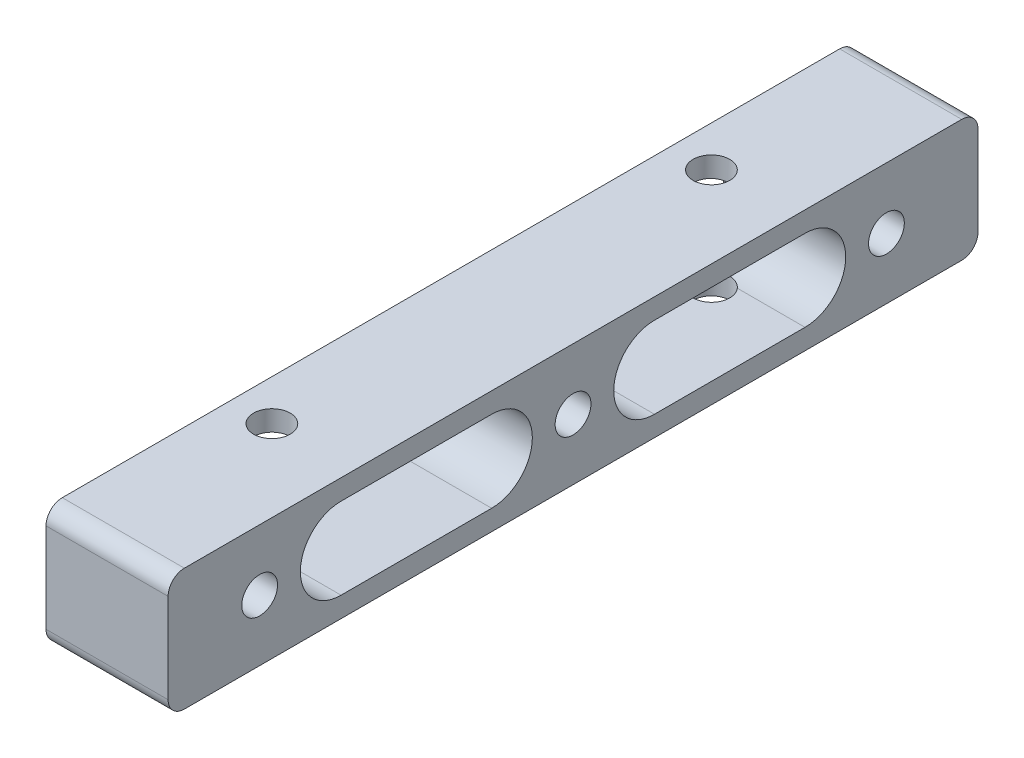
ISO-10303-21;
HEADER;
FILE_DESCRIPTION(('STEP AP214'),'2;1');
FILE_NAME('part.step','',(''),(''),'','','');
FILE_SCHEMA(('AUTOMOTIVE_DESIGN { 1 0 10303 214 1 1 1 1 }'));
ENDSEC;
DATA;
#1=APPLICATION_CONTEXT('core data for automotive mechanical design processes');
#2=APPLICATION_PROTOCOL_DEFINITION('international standard','automotive_design',2000,#1);
#3=PRODUCT_CONTEXT('',#1,'mechanical');
#4=PRODUCT('Part','Part','',(#3));
#5=PRODUCT_RELATED_PRODUCT_CATEGORY('part','',(#4));
#6=PRODUCT_DEFINITION_FORMATION('','',#4);
#7=PRODUCT_DEFINITION_CONTEXT('part definition',#1,'design');
#8=PRODUCT_DEFINITION('design','',#6,#7);
#9=PRODUCT_DEFINITION_SHAPE('','',#8);
#10=(LENGTH_UNIT() NAMED_UNIT(*) SI_UNIT(.MILLI.,.METRE.));
#11=(NAMED_UNIT(*) PLANE_ANGLE_UNIT() SI_UNIT($,.RADIAN.));
#12=(NAMED_UNIT(*) SI_UNIT($,.STERADIAN.) SOLID_ANGLE_UNIT());
#13=UNCERTAINTY_MEASURE_WITH_UNIT(LENGTH_MEASURE(1.E-05),#10,'distance_accuracy_value','');
#14=(GEOMETRIC_REPRESENTATION_CONTEXT(3) GLOBAL_UNCERTAINTY_ASSIGNED_CONTEXT((#13)) GLOBAL_UNIT_ASSIGNED_CONTEXT((#10,
#11,#12)) REPRESENTATION_CONTEXT('',''));
#15=CARTESIAN_POINT('',(0.,0.,0.));
#16=DIRECTION('',(0.,0.,1.));
#17=DIRECTION('',(1.,0.,0.));
#18=AXIS2_PLACEMENT_3D('',#15,#16,#17);
#19=CARTESIAN_POINT('',(15.,0.,0.));
#20=DIRECTION('',(0.,0.,-1.));
#21=DIRECTION('',(0.,1.,0.));
#22=AXIS2_PLACEMENT_3D('',#19,#20,#21);
#23=PLANE('',#22);
#24=DIRECTION('',(0.,-1.,0.));
#25=VECTOR('',#24,1.);
#26=CARTESIAN_POINT('',(0.,0.,0.));
#27=LINE('',#26,#25);
#28=CARTESIAN_POINT('',(0.,-2.,0.));
#29=VERTEX_POINT('',#28);
#30=CARTESIAN_POINT('',(0.,-13.,0.));
#31=VERTEX_POINT('',#30);
#32=EDGE_CURVE('E257',#29,#31,#27,.T.);
#33=ORIENTED_EDGE('',*,*,#32,.T.);
#34=DIRECTION('',(-1.,0.,0.));
#35=VECTOR('',#34,1.);
#36=CARTESIAN_POINT('',(15.,-13.,0.));
#37=LINE('',#36,#35);
#38=CARTESIAN_POINT('',(15.,-13.,0.));
#39=VERTEX_POINT('',#38);
#40=EDGE_CURVE('E180',#31,#39,#37,.F.);
#41=ORIENTED_EDGE('',*,*,#40,.T.);
#42=DIRECTION('',(0.,-1.,0.));
#43=VECTOR('',#42,1.);
#44=CARTESIAN_POINT('',(15.,0.,0.));
#45=LINE('',#44,#43);
#46=CARTESIAN_POINT('',(15.,-2.,0.));
#47=VERTEX_POINT('',#46);
#48=EDGE_CURVE('E243',#47,#39,#45,.T.);
#49=ORIENTED_EDGE('',*,*,#48,.F.);
#50=DIRECTION('',(-1.,0.,0.));
#51=VECTOR('',#50,1.);
#52=CARTESIAN_POINT('',(15.,-2.,0.));
#53=LINE('',#52,#51);
#54=EDGE_CURVE('E328',#47,#29,#53,.T.);
#55=ORIENTED_EDGE('',*,*,#54,.T.);
#56=EDGE_LOOP('',(#33,#41,#49,#55));
#57=FACE_BOUND('',#56,.T.);
#58=ADVANCED_FACE('F39',(#57),#23,.F.);
#59=CARTESIAN_POINT('',(15.,-15.,0.));
#60=DIRECTION('',(0.,1.,0.));
#61=DIRECTION('',(0.,0.,1.));
#62=AXIS2_PLACEMENT_3D('',#59,#60,#61);
#63=PLANE('',#62);
#64=CARTESIAN_POINT('',(5.00000000000001,-15.,-22.75));
#65=DIRECTION('',(0.,1.,0.));
#66=DIRECTION('',(0.,0.,1.));
#67=AXIS2_PLACEMENT_3D('',#64,#65,#66);
#68=CIRCLE('',#67,2.25);
#69=CARTESIAN_POINT('',(5.00000000000001,-15.,-20.5));
#70=VERTEX_POINT('',#69);
#71=EDGE_CURVE('E677',#70,#70,#68,.T.);
#72=ORIENTED_EDGE('',*,*,#71,.T.);
#73=EDGE_LOOP('',(#72));
#74=FACE_BOUND('',#73,.T.);
#75=CARTESIAN_POINT('',(5.00000000000001,-15.,-76.75));
#76=DIRECTION('',(0.,1.,0.));
#77=DIRECTION('',(0.,0.,1.));
#78=AXIS2_PLACEMENT_3D('',#75,#76,#77);
#79=CIRCLE('',#78,2.25);
#80=CARTESIAN_POINT('',(5.00000000000001,-15.,-74.5));
#81=VERTEX_POINT('',#80);
#82=EDGE_CURVE('E220',#81,#81,#79,.T.);
#83=ORIENTED_EDGE('',*,*,#82,.T.);
#84=EDGE_LOOP('',(#83));
#85=FACE_BOUND('',#84,.T.);
#86=DIRECTION('',(0.,0.,-1.));
#87=VECTOR('',#86,1.);
#88=CARTESIAN_POINT('',(0.,-15.,0.));
#89=LINE('',#88,#87);
#90=CARTESIAN_POINT('',(0.,-15.,-2.));
#91=VERTEX_POINT('',#90);
#92=CARTESIAN_POINT('',(0.,-15.,-97.5));
#93=VERTEX_POINT('',#92);
#94=EDGE_CURVE('E260',#91,#93,#89,.T.);
#95=ORIENTED_EDGE('',*,*,#94,.T.);
#96=DIRECTION('',(-1.,0.,0.));
#97=VECTOR('',#96,1.);
#98=CARTESIAN_POINT('',(15.,-15.,-97.5));
#99=LINE('',#98,#97);
#100=CARTESIAN_POINT('',(15.,-15.,-97.5));
#101=VERTEX_POINT('',#100);
#102=EDGE_CURVE('E313',#93,#101,#99,.F.);
#103=ORIENTED_EDGE('',*,*,#102,.T.);
#104=DIRECTION('',(0.,0.,-1.));
#105=VECTOR('',#104,1.);
#106=CARTESIAN_POINT('',(15.,-15.,0.));
#107=LINE('',#106,#105);
#108=CARTESIAN_POINT('',(15.,-15.,-2.));
#109=VERTEX_POINT('',#108);
#110=EDGE_CURVE('E246',#109,#101,#107,.T.);
#111=ORIENTED_EDGE('',*,*,#110,.F.);
#112=DIRECTION('',(-1.,0.,0.));
#113=VECTOR('',#112,1.);
#114=CARTESIAN_POINT('',(15.,-15.,-2.));
#115=LINE('',#114,#113);
#116=EDGE_CURVE('E310',#109,#91,#115,.T.);
#117=ORIENTED_EDGE('',*,*,#116,.T.);
#118=EDGE_LOOP('',(#95,#103,#111,#117));
#119=FACE_BOUND('',#118,.T.);
#120=ADVANCED_FACE('F346',(#74,#85,#119),#63,.F.);
#121=CARTESIAN_POINT('',(15.,0.,-99.5));
#122=DIRECTION('',(0.,0.,1.));
#123=DIRECTION('',(0.,-1.,0.));
#124=AXIS2_PLACEMENT_3D('',#121,#122,#123);
#125=PLANE('',#124);
#126=DIRECTION('',(0.,1.,0.));
#127=VECTOR('',#126,1.);
#128=CARTESIAN_POINT('',(15.,0.,-99.5));
#129=LINE('',#128,#127);
#130=CARTESIAN_POINT('',(15.,-13.,-99.5));
#131=VERTEX_POINT('',#130);
#132=CARTESIAN_POINT('',(15.,-2.,-99.5));
#133=VERTEX_POINT('',#132);
#134=EDGE_CURVE('E250',#131,#133,#129,.T.);
#135=ORIENTED_EDGE('',*,*,#134,.F.);
#136=DIRECTION('',(-1.,0.,0.));
#137=VECTOR('',#136,1.);
#138=CARTESIAN_POINT('',(15.,-13.,-99.5));
#139=LINE('',#138,#137);
#140=CARTESIAN_POINT('',(0.,-13.,-99.5));
#141=VERTEX_POINT('',#140);
#142=EDGE_CURVE('E299',#131,#141,#139,.T.);
#143=ORIENTED_EDGE('',*,*,#142,.T.);
#144=DIRECTION('',(0.,1.,0.));
#145=VECTOR('',#144,1.);
#146=CARTESIAN_POINT('',(0.,0.,-99.5));
#147=LINE('',#146,#145);
#148=CARTESIAN_POINT('',(0.,-2.,-99.5));
#149=VERTEX_POINT('',#148);
#150=EDGE_CURVE('E264',#141,#149,#147,.T.);
#151=ORIENTED_EDGE('',*,*,#150,.T.);
#152=DIRECTION('',(-1.,0.,0.));
#153=VECTOR('',#152,1.);
#154=CARTESIAN_POINT('',(15.,-2.,-99.5));
#155=LINE('',#154,#153);
#156=EDGE_CURVE('E297',#149,#133,#155,.F.);
#157=ORIENTED_EDGE('',*,*,#156,.T.);
#158=EDGE_LOOP('',(#135,#143,#151,#157));
#159=FACE_BOUND('',#158,.T.);
#160=ADVANCED_FACE('F357',(#159),#125,.F.);
#161=CARTESIAN_POINT('',(15.,0.,0.));
#162=DIRECTION('',(0.,-1.,0.));
#163=DIRECTION('',(0.,0.,-1.));
#164=AXIS2_PLACEMENT_3D('',#161,#162,#163);
#165=PLANE('',#164);
#166=CARTESIAN_POINT('',(5.00000000000001,0.,-22.75));
#167=DIRECTION('',(0.,1.,0.));
#168=DIRECTION('',(0.,0.,1.));
#169=AXIS2_PLACEMENT_3D('',#166,#167,#168);
#170=CIRCLE('',#169,2.25);
#171=CARTESIAN_POINT('',(5.00000000000001,0.,-20.5));
#172=VERTEX_POINT('',#171);
#173=EDGE_CURVE('E190',#172,#172,#170,.T.);
#174=ORIENTED_EDGE('',*,*,#173,.F.);
#175=EDGE_LOOP('',(#174));
#176=FACE_BOUND('',#175,.T.);
#177=CARTESIAN_POINT('',(5.00000000000001,0.,-76.75));
#178=DIRECTION('',(0.,1.,0.));
#179=DIRECTION('',(0.,0.,1.));
#180=AXIS2_PLACEMENT_3D('',#177,#178,#179);
#181=CIRCLE('',#180,2.25);
#182=CARTESIAN_POINT('',(5.00000000000001,0.,-74.5));
#183=VERTEX_POINT('',#182);
#184=EDGE_CURVE('E724',#183,#183,#181,.T.);
#185=ORIENTED_EDGE('',*,*,#184,.F.);
#186=EDGE_LOOP('',(#185));
#187=FACE_BOUND('',#186,.T.);
#188=DIRECTION('',(0.,0.,1.));
#189=VECTOR('',#188,1.);
#190=CARTESIAN_POINT('',(15.,0.,0.));
#191=LINE('',#190,#189);
#192=CARTESIAN_POINT('',(15.,0.,-97.5));
#193=VERTEX_POINT('',#192);
#194=CARTESIAN_POINT('',(15.,0.,-2.));
#195=VERTEX_POINT('',#194);
#196=EDGE_CURVE('E253',#193,#195,#191,.T.);
#197=ORIENTED_EDGE('',*,*,#196,.F.);
#198=DIRECTION('',(-1.,0.,0.));
#199=VECTOR('',#198,1.);
#200=CARTESIAN_POINT('',(15.,0.,-97.5));
#201=LINE('',#200,#199);
#202=CARTESIAN_POINT('',(0.,0.,-97.5));
#203=VERTEX_POINT('',#202);
#204=EDGE_CURVE('E325',#193,#203,#201,.T.);
#205=ORIENTED_EDGE('',*,*,#204,.T.);
#206=DIRECTION('',(0.,0.,1.));
#207=VECTOR('',#206,1.);
#208=CARTESIAN_POINT('',(0.,0.,0.));
#209=LINE('',#208,#207);
#210=CARTESIAN_POINT('',(0.,0.,-2.));
#211=VERTEX_POINT('',#210);
#212=EDGE_CURVE('E247',#203,#211,#209,.T.);
#213=ORIENTED_EDGE('',*,*,#212,.T.);
#214=DIRECTION('',(-1.,0.,0.));
#215=VECTOR('',#214,1.);
#216=CARTESIAN_POINT('',(15.,0.,-2.));
#217=LINE('',#216,#215);
#218=EDGE_CURVE('E323',#211,#195,#217,.F.);
#219=ORIENTED_EDGE('',*,*,#218,.T.);
#220=EDGE_LOOP('',(#197,#205,#213,#219));
#221=FACE_BOUND('',#220,.T.);
#222=ADVANCED_FACE('F366',(#176,#187,#221),#165,.F.);
#223=CARTESIAN_POINT('',(15.,0.,0.));
#224=DIRECTION('',(1.,0.,0.));
#225=DIRECTION('',(0.,0.,-1.));
#226=AXIS2_PLACEMENT_3D('',#223,#224,#225);
#227=PLANE('',#226);
#228=CARTESIAN_POINT('',(15.,-7.5,-39.75));
#229=DIRECTION('',(1.,0.,0.));
#230=DIRECTION('',(0.,0.,-1.));
#231=AXIS2_PLACEMENT_3D('',#228,#229,#230);
#232=CIRCLE('',#231,5.);
#233=CARTESIAN_POINT('',(15.,-12.5,-39.75));
#234=VERTEX_POINT('',#233);
#235=CARTESIAN_POINT('',(15.,-2.5,-39.75));
#236=VERTEX_POINT('',#235);
#237=EDGE_CURVE('E231',#234,#236,#232,.T.);
#238=ORIENTED_EDGE('',*,*,#237,.F.);
#239=DIRECTION('',(0.,0.,-1.));
#240=VECTOR('',#239,1.);
#241=CARTESIAN_POINT('',(15.,-12.5,-21.25));
#242=LINE('',#241,#240);
#243=CARTESIAN_POINT('',(15.,-12.5,-21.25));
#244=VERTEX_POINT('',#243);
#245=EDGE_CURVE('E200',#244,#234,#242,.T.);
#246=ORIENTED_EDGE('',*,*,#245,.F.);
#247=CARTESIAN_POINT('',(15.,-7.5,-21.25));
#248=DIRECTION('',(1.,0.,0.));
#249=DIRECTION('',(0.,0.,-1.));
#250=AXIS2_PLACEMENT_3D('',#247,#248,#249);
#251=CIRCLE('',#250,5.00000000000001);
#252=CARTESIAN_POINT('',(15.,-2.49999999999999,-21.25));
#253=VERTEX_POINT('',#252);
#254=EDGE_CURVE('E698',#253,#244,#251,.T.);
#255=ORIENTED_EDGE('',*,*,#254,.F.);
#256=DIRECTION('',(0.,0.,-1.));
#257=VECTOR('',#256,1.);
#258=CARTESIAN_POINT('',(15.,-2.5,-21.25));
#259=LINE('',#258,#257);
#260=EDGE_CURVE('E195',#253,#236,#259,.T.);
#261=ORIENTED_EDGE('',*,*,#260,.T.);
#262=EDGE_LOOP('',(#238,#246,#255,#261));
#263=FACE_BOUND('',#262,.T.);
#264=CARTESIAN_POINT('',(15.,-7.5,-59.75));
#265=DIRECTION('',(1.,0.,0.));
#266=DIRECTION('',(0.,0.,-1.));
#267=AXIS2_PLACEMENT_3D('',#264,#265,#266);
#268=CIRCLE('',#267,5.);
#269=CARTESIAN_POINT('',(15.,-2.49999999999999,-59.75));
#270=VERTEX_POINT('',#269);
#271=CARTESIAN_POINT('',(15.,-12.5,-59.75));
#272=VERTEX_POINT('',#271);
#273=EDGE_CURVE('E229',#270,#272,#268,.T.);
#274=ORIENTED_EDGE('',*,*,#273,.F.);
#275=DIRECTION('',(0.,0.,-1.));
#276=VECTOR('',#275,1.);
#277=CARTESIAN_POINT('',(15.,-2.49999999999999,-59.75));
#278=LINE('',#277,#276);
#279=CARTESIAN_POINT('',(15.,-2.49999999999998,-78.25));
#280=VERTEX_POINT('',#279);
#281=EDGE_CURVE('E209',#270,#280,#278,.T.);
#282=ORIENTED_EDGE('',*,*,#281,.T.);
#283=CARTESIAN_POINT('',(15.,-7.49999999999999,-78.25));
#284=DIRECTION('',(1.,0.,0.));
#285=DIRECTION('',(0.,0.,-1.));
#286=AXIS2_PLACEMENT_3D('',#283,#284,#285);
#287=CIRCLE('',#286,5.00000000000001);
#288=CARTESIAN_POINT('',(15.,-12.5,-78.25));
#289=VERTEX_POINT('',#288);
#290=EDGE_CURVE('E223',#289,#280,#287,.T.);
#291=ORIENTED_EDGE('',*,*,#290,.F.);
#292=DIRECTION('',(0.,0.,-1.));
#293=VECTOR('',#292,1.);
#294=CARTESIAN_POINT('',(15.,-12.5,-59.75));
#295=LINE('',#294,#293);
#296=EDGE_CURVE('E226',#272,#289,#295,.T.);
#297=ORIENTED_EDGE('',*,*,#296,.F.);
#298=EDGE_LOOP('',(#274,#282,#291,#297));
#299=FACE_BOUND('',#298,.T.);
#300=CARTESIAN_POINT('',(15.,-7.49999999999999,-88.25));
#301=DIRECTION('',(1.,0.,0.));
#302=DIRECTION('',(0.,0.,-1.));
#303=AXIS2_PLACEMENT_3D('',#300,#301,#302);
#304=CIRCLE('',#303,2.2);
#305=CARTESIAN_POINT('',(15.,-7.49999999999999,-90.45));
#306=VERTEX_POINT('',#305);
#307=EDGE_CURVE('E236',#306,#306,#304,.T.);
#308=ORIENTED_EDGE('',*,*,#307,.F.);
#309=EDGE_LOOP('',(#308));
#310=FACE_BOUND('',#309,.T.);
#311=CARTESIAN_POINT('',(15.,-7.5,-11.25));
#312=DIRECTION('',(1.,0.,0.));
#313=DIRECTION('',(0.,0.,-1.));
#314=AXIS2_PLACEMENT_3D('',#311,#312,#313);
#315=CIRCLE('',#314,2.2);
#316=CARTESIAN_POINT('',(15.,-7.5,-13.45));
#317=VERTEX_POINT('',#316);
#318=EDGE_CURVE('E232',#317,#317,#315,.T.);
#319=ORIENTED_EDGE('',*,*,#318,.F.);
#320=EDGE_LOOP('',(#319));
#321=FACE_BOUND('',#320,.T.);
#322=CARTESIAN_POINT('',(15.,-7.5,-49.75));
#323=DIRECTION('',(1.,0.,0.));
#324=DIRECTION('',(0.,0.,-1.));
#325=AXIS2_PLACEMENT_3D('',#322,#323,#324);
#326=CIRCLE('',#325,2.2);
#327=CARTESIAN_POINT('',(15.,-7.5,-51.95));
#328=VERTEX_POINT('',#327);
#329=EDGE_CURVE('E235',#328,#328,#326,.T.);
#330=ORIENTED_EDGE('',*,*,#329,.F.);
#331=EDGE_LOOP('',(#330));
#332=FACE_BOUND('',#331,.T.);
#333=ORIENTED_EDGE('',*,*,#110,.T.);
#334=CARTESIAN_POINT('',(15.,-13.,-97.5));
#335=DIRECTION('',(1.,0.,0.));
#336=DIRECTION('',(0.,0.,-1.));
#337=AXIS2_PLACEMENT_3D('',#334,#335,#336);
#338=CIRCLE('',#337,2.);
#339=EDGE_CURVE('E321',#101,#131,#338,.T.);
#340=ORIENTED_EDGE('',*,*,#339,.T.);
#341=ORIENTED_EDGE('',*,*,#134,.T.);
#342=CARTESIAN_POINT('',(15.,-2.,-97.5));
#343=DIRECTION('',(1.,0.,0.));
#344=DIRECTION('',(0.,0.,-1.));
#345=AXIS2_PLACEMENT_3D('',#342,#343,#344);
#346=CIRCLE('',#345,2.);
#347=EDGE_CURVE('E319',#133,#193,#346,.T.);
#348=ORIENTED_EDGE('',*,*,#347,.T.);
#349=ORIENTED_EDGE('',*,*,#196,.T.);
#350=CARTESIAN_POINT('',(15.,-2.,-2.));
#351=DIRECTION('',(1.,0.,0.));
#352=DIRECTION('',(0.,0.,-1.));
#353=AXIS2_PLACEMENT_3D('',#350,#351,#352);
#354=CIRCLE('',#353,2.);
#355=EDGE_CURVE('E315',#195,#47,#354,.T.);
#356=ORIENTED_EDGE('',*,*,#355,.T.);
#357=ORIENTED_EDGE('',*,*,#48,.T.);
#358=CARTESIAN_POINT('',(15.,-13.,-2.));
#359=DIRECTION('',(1.,0.,0.));
#360=DIRECTION('',(0.,0.,-1.));
#361=AXIS2_PLACEMENT_3D('',#358,#359,#360);
#362=CIRCLE('',#361,2.);
#363=EDGE_CURVE('E317',#39,#109,#362,.T.);
#364=ORIENTED_EDGE('',*,*,#363,.T.);
#365=EDGE_LOOP('',(#333,#340,#341,#348,#349,#356,#357,#364));
#366=FACE_BOUND('',#365,.T.);
#367=ADVANCED_FACE('F339',(#263,#299,#310,#321,#332,#366),#227,.T.);
#368=CARTESIAN_POINT('',(0.,0.,0.));
#369=DIRECTION('',(1.,0.,0.));
#370=DIRECTION('',(0.,0.,-1.));
#371=AXIS2_PLACEMENT_3D('',#368,#369,#370);
#372=PLANE('',#371);
#373=DIRECTION('',(0.,0.,-1.));
#374=VECTOR('',#373,1.);
#375=CARTESIAN_POINT('',(0.,-12.5,0.));
#376=LINE('',#375,#374);
#377=CARTESIAN_POINT('',(0.,-12.5,-21.25));
#378=VERTEX_POINT('',#377);
#379=CARTESIAN_POINT('',(0.,-12.5,-39.75));
#380=VERTEX_POINT('',#379);
#381=EDGE_CURVE('E291',#378,#380,#376,.T.);
#382=ORIENTED_EDGE('',*,*,#381,.T.);
#383=CARTESIAN_POINT('',(0.,-7.5,-39.75));
#384=DIRECTION('',(1.,0.,0.));
#385=DIRECTION('',(0.,0.,-1.));
#386=AXIS2_PLACEMENT_3D('',#383,#384,#385);
#387=CIRCLE('',#386,5.);
#388=CARTESIAN_POINT('',(0.,-2.5,-39.75));
#389=VERTEX_POINT('',#388);
#390=EDGE_CURVE('E294',#380,#389,#387,.T.);
#391=ORIENTED_EDGE('',*,*,#390,.T.);
#392=DIRECTION('',(0.,0.,-1.));
#393=VECTOR('',#392,1.);
#394=CARTESIAN_POINT('',(0.,-2.5,0.));
#395=LINE('',#394,#393);
#396=CARTESIAN_POINT('',(0.,-2.5,-21.25));
#397=VERTEX_POINT('',#396);
#398=EDGE_CURVE('E286',#397,#389,#395,.T.);
#399=ORIENTED_EDGE('',*,*,#398,.F.);
#400=CARTESIAN_POINT('',(0.,-7.5,-21.25));
#401=DIRECTION('',(1.,0.,0.));
#402=DIRECTION('',(0.,0.,-1.));
#403=AXIS2_PLACEMENT_3D('',#400,#401,#402);
#404=CIRCLE('',#403,5.00000000000001);
#405=EDGE_CURVE('E288',#397,#378,#404,.T.);
#406=ORIENTED_EDGE('',*,*,#405,.T.);
#407=EDGE_LOOP('',(#382,#391,#399,#406));
#408=FACE_BOUND('',#407,.T.);
#409=DIRECTION('',(0.,0.,-1.));
#410=VECTOR('',#409,1.);
#411=CARTESIAN_POINT('',(0.,-2.50000000000001,0.));
#412=LINE('',#411,#410);
#413=CARTESIAN_POINT('',(0.,-2.49999999999999,-59.75));
#414=VERTEX_POINT('',#413);
#415=CARTESIAN_POINT('',(0.,-2.49999999999998,-78.25));
#416=VERTEX_POINT('',#415);
#417=EDGE_CURVE('E281',#414,#416,#412,.T.);
#418=ORIENTED_EDGE('',*,*,#417,.F.);
#419=CARTESIAN_POINT('',(0.,-7.5,-59.75));
#420=DIRECTION('',(1.,0.,0.));
#421=DIRECTION('',(0.,0.,-1.));
#422=AXIS2_PLACEMENT_3D('',#419,#420,#421);
#423=CIRCLE('',#422,5.);
#424=CARTESIAN_POINT('',(0.,-12.5,-59.75));
#425=VERTEX_POINT('',#424);
#426=EDGE_CURVE('E283',#414,#425,#423,.T.);
#427=ORIENTED_EDGE('',*,*,#426,.T.);
#428=DIRECTION('',(0.,0.,-1.));
#429=VECTOR('',#428,1.);
#430=CARTESIAN_POINT('',(0.,-12.5,0.));
#431=LINE('',#430,#429);
#432=CARTESIAN_POINT('',(0.,-12.5,-78.25));
#433=VERTEX_POINT('',#432);
#434=EDGE_CURVE('E256',#425,#433,#431,.T.);
#435=ORIENTED_EDGE('',*,*,#434,.T.);
#436=CARTESIAN_POINT('',(0.,-7.49999999999999,-78.25));
#437=DIRECTION('',(1.,0.,0.));
#438=DIRECTION('',(0.,0.,-1.));
#439=AXIS2_PLACEMENT_3D('',#436,#437,#438);
#440=CIRCLE('',#439,5.00000000000001);
#441=EDGE_CURVE('E278',#433,#416,#440,.T.);
#442=ORIENTED_EDGE('',*,*,#441,.T.);
#443=EDGE_LOOP('',(#418,#427,#435,#442));
#444=FACE_BOUND('',#443,.T.);
#445=CARTESIAN_POINT('',(0.,-7.49999999999999,-88.25));
#446=DIRECTION('',(1.,0.,0.));
#447=DIRECTION('',(0.,0.,-1.));
#448=AXIS2_PLACEMENT_3D('',#445,#446,#447);
#449=CIRCLE('',#448,2.2);
#450=CARTESIAN_POINT('',(0.,-7.49999999999999,-90.45));
#451=VERTEX_POINT('',#450);
#452=EDGE_CURVE('E261',#451,#451,#449,.T.);
#453=ORIENTED_EDGE('',*,*,#452,.T.);
#454=EDGE_LOOP('',(#453));
#455=FACE_BOUND('',#454,.T.);
#456=CARTESIAN_POINT('',(0.,-7.5,-11.25));
#457=DIRECTION('',(1.,0.,0.));
#458=DIRECTION('',(0.,0.,-1.));
#459=AXIS2_PLACEMENT_3D('',#456,#457,#458);
#460=CIRCLE('',#459,2.2);
#461=CARTESIAN_POINT('',(0.,-7.5,-13.45));
#462=VERTEX_POINT('',#461);
#463=EDGE_CURVE('E271',#462,#462,#460,.T.);
#464=ORIENTED_EDGE('',*,*,#463,.T.);
#465=EDGE_LOOP('',(#464));
#466=FACE_BOUND('',#465,.T.);
#467=CARTESIAN_POINT('',(0.,-7.5,-49.75));
#468=DIRECTION('',(1.,0.,0.));
#469=DIRECTION('',(0.,0.,-1.));
#470=AXIS2_PLACEMENT_3D('',#467,#468,#469);
#471=CIRCLE('',#470,2.2);
#472=CARTESIAN_POINT('',(0.,-7.5,-51.95));
#473=VERTEX_POINT('',#472);
#474=EDGE_CURVE('E242',#473,#473,#471,.T.);
#475=ORIENTED_EDGE('',*,*,#474,.T.);
#476=EDGE_LOOP('',(#475));
#477=FACE_BOUND('',#476,.T.);
#478=ORIENTED_EDGE('',*,*,#150,.F.);
#479=CARTESIAN_POINT('',(0.,-13.,-97.5));
#480=DIRECTION('',(1.,0.,0.));
#481=DIRECTION('',(0.,0.,-1.));
#482=AXIS2_PLACEMENT_3D('',#479,#480,#481);
#483=CIRCLE('',#482,2.);
#484=EDGE_CURVE('E308',#141,#93,#483,.F.);
#485=ORIENTED_EDGE('',*,*,#484,.T.);
#486=ORIENTED_EDGE('',*,*,#94,.F.);
#487=CARTESIAN_POINT('',(0.,-13.,-2.));
#488=DIRECTION('',(1.,0.,0.));
#489=DIRECTION('',(0.,0.,-1.));
#490=AXIS2_PLACEMENT_3D('',#487,#488,#489);
#491=CIRCLE('',#490,2.);
#492=EDGE_CURVE('E304',#91,#31,#491,.F.);
#493=ORIENTED_EDGE('',*,*,#492,.T.);
#494=ORIENTED_EDGE('',*,*,#32,.F.);
#495=CARTESIAN_POINT('',(0.,-2.,-2.));
#496=DIRECTION('',(1.,0.,0.));
#497=DIRECTION('',(0.,0.,-1.));
#498=AXIS2_PLACEMENT_3D('',#495,#496,#497);
#499=CIRCLE('',#498,2.);
#500=EDGE_CURVE('E302',#29,#211,#499,.F.);
#501=ORIENTED_EDGE('',*,*,#500,.T.);
#502=ORIENTED_EDGE('',*,*,#212,.F.);
#503=CARTESIAN_POINT('',(0.,-2.,-97.5));
#504=DIRECTION('',(1.,0.,0.));
#505=DIRECTION('',(0.,0.,-1.));
#506=AXIS2_PLACEMENT_3D('',#503,#504,#505);
#507=CIRCLE('',#506,2.);
#508=EDGE_CURVE('E306',#203,#149,#507,.F.);
#509=ORIENTED_EDGE('',*,*,#508,.T.);
#510=EDGE_LOOP('',(#478,#485,#486,#493,#494,#501,#502,#509));
#511=FACE_BOUND('',#510,.T.);
#512=ADVANCED_FACE('F350',(#408,#444,#455,#466,#477,#511),#372,.F.);
#513=CARTESIAN_POINT('',(-40.,-7.5,-49.75));
#514=DIRECTION('',(1.,0.,0.));
#515=DIRECTION('',(0.,0.,-1.));
#516=AXIS2_PLACEMENT_3D('',#513,#514,#515);
#517=CYLINDRICAL_SURFACE('',#516,2.2);
#518=ORIENTED_EDGE('',*,*,#329,.T.);
#519=EDGE_LOOP('',(#518));
#520=FACE_BOUND('',#519,.T.);
#521=ORIENTED_EDGE('',*,*,#474,.F.);
#522=EDGE_LOOP('',(#521));
#523=FACE_BOUND('',#522,.T.);
#524=ADVANCED_FACE('F583',(#520,#523),#517,.F.);
#525=CARTESIAN_POINT('',(-40.,-7.5,-11.25));
#526=DIRECTION('',(1.,0.,0.));
#527=DIRECTION('',(0.,0.,-1.));
#528=AXIS2_PLACEMENT_3D('',#525,#526,#527);
#529=CYLINDRICAL_SURFACE('',#528,2.2);
#530=ORIENTED_EDGE('',*,*,#318,.T.);
#531=EDGE_LOOP('',(#530));
#532=FACE_BOUND('',#531,.T.);
#533=ORIENTED_EDGE('',*,*,#463,.F.);
#534=EDGE_LOOP('',(#533));
#535=FACE_BOUND('',#534,.T.);
#536=ADVANCED_FACE('F573',(#532,#535),#529,.F.);
#537=CARTESIAN_POINT('',(-40.,-7.49999999999999,-88.25));
#538=DIRECTION('',(1.,0.,0.));
#539=DIRECTION('',(0.,0.,-1.));
#540=AXIS2_PLACEMENT_3D('',#537,#538,#539);
#541=CYLINDRICAL_SURFACE('',#540,2.2);
#542=ORIENTED_EDGE('',*,*,#307,.T.);
#543=EDGE_LOOP('',(#542));
#544=FACE_BOUND('',#543,.T.);
#545=ORIENTED_EDGE('',*,*,#452,.F.);
#546=EDGE_LOOP('',(#545));
#547=FACE_BOUND('',#546,.T.);
#548=ADVANCED_FACE('F563',(#544,#547),#541,.F.);
#549=CARTESIAN_POINT('',(-33.,-7.5,-59.75));
#550=DIRECTION('',(1.,0.,0.));
#551=DIRECTION('',(0.,0.,-1.));
#552=AXIS2_PLACEMENT_3D('',#549,#550,#551);
#553=CYLINDRICAL_SURFACE('',#552,5.);
#554=DIRECTION('',(1.,0.,0.));
#555=VECTOR('',#554,1.);
#556=CARTESIAN_POINT('',(-33.,-2.49999999999999,-59.75));
#557=LINE('',#556,#555);
#558=EDGE_CURVE('E218',#414,#270,#557,.T.);
#559=ORIENTED_EDGE('',*,*,#558,.T.);
#560=ORIENTED_EDGE('',*,*,#273,.T.);
#561=DIRECTION('',(1.,0.,0.));
#562=VECTOR('',#561,1.);
#563=CARTESIAN_POINT('',(-33.,-12.5,-59.75));
#564=LINE('',#563,#562);
#565=EDGE_CURVE('E206',#425,#272,#564,.T.);
#566=ORIENTED_EDGE('',*,*,#565,.F.);
#567=ORIENTED_EDGE('',*,*,#426,.F.);
#568=EDGE_LOOP('',(#559,#560,#566,#567));
#569=FACE_BOUND('',#568,.T.);
#570=ADVANCED_FACE('F438',(#569),#553,.F.);
#571=CARTESIAN_POINT('',(-33.,-2.49999999999999,-59.75));
#572=DIRECTION('',(0.,-1.,0.));
#573=DIRECTION('',(0.,0.,-1.));
#574=AXIS2_PLACEMENT_3D('',#571,#572,#573);
#575=PLANE('',#574);
#576=CARTESIAN_POINT('',(5.00000000000001,-2.49999999999999,-76.75));
#577=DIRECTION('',(0.,-1.,0.));
#578=DIRECTION('',(0.,0.,-1.));
#579=AXIS2_PLACEMENT_3D('',#576,#577,#578);
#580=CIRCLE('',#579,2.25);
#581=CARTESIAN_POINT('',(6.67705098312484,-2.49999999999998,-78.25));
#582=VERTEX_POINT('',#581);
#583=CARTESIAN_POINT('',(3.32294901687517,-2.49999999999998,-78.25));
#584=VERTEX_POINT('',#583);
#585=EDGE_CURVE('E53',#582,#584,#580,.T.);
#586=ORIENTED_EDGE('',*,*,#585,.F.);
#587=DIRECTION('',(1.,0.,0.));
#588=VECTOR('',#587,1.);
#589=CARTESIAN_POINT('',(-33.,-2.49999999999998,-78.25));
#590=LINE('',#589,#588);
#591=EDGE_CURVE('E217',#582,#280,#590,.T.);
#592=ORIENTED_EDGE('',*,*,#591,.T.);
#593=ORIENTED_EDGE('',*,*,#281,.F.);
#594=ORIENTED_EDGE('',*,*,#558,.F.);
#595=ORIENTED_EDGE('',*,*,#417,.T.);
#596=EDGE_CURVE('E214',#416,#584,#590,.T.);
#597=ORIENTED_EDGE('',*,*,#596,.T.);
#598=EDGE_LOOP('',(#586,#592,#593,#594,#595,#597));
#599=FACE_BOUND('',#598,.T.);
#600=ADVANCED_FACE('F432',(#599),#575,.T.);
#601=CARTESIAN_POINT('',(-33.,-7.49999999999999,-78.25));
#602=DIRECTION('',(1.,0.,0.));
#603=DIRECTION('',(0.,0.,-1.));
#604=AXIS2_PLACEMENT_3D('',#601,#602,#603);
#605=CYLINDRICAL_SURFACE('',#604,5.00000000000001);
#606=ORIENTED_EDGE('',*,*,#591,.F.);
#607=CARTESIAN_POINT('',(6.67705098312484,-2.49999999999998,-78.25));
#608=CARTESIAN_POINT('',(6.63498223128396,-2.4999996344709,-78.2970347112612));
#609=CARTESIAN_POINT('',(6.59095711158803,-2.50066364099418,-78.3422715872705));
#610=CARTESIAN_POINT('',(6.49928974171344,-2.50301295208134,-78.4288710853383));
#611=CARTESIAN_POINT('',(6.45164823861974,-2.50469804620496,-78.4702345036667));
#612=CARTESIAN_POINT('',(6.30387775297277,-2.51081774944992,-78.5879952744327));
#613=CARTESIAN_POINT('',(6.19876213888989,-2.51631880858093,-78.6582200215644));
#614=CARTESIAN_POINT('',(5.97835614480261,-2.52779824518516,-78.7800735147589));
#615=CARTESIAN_POINT('',(5.86306589262374,-2.53377661666175,-78.8317024944018));
#616=CARTESIAN_POINT('',(5.62541824175998,-2.54424008448798,-78.9149921009603));
#617=CARTESIAN_POINT('',(5.503062070903,-2.5487254393648,-78.9466561857994));
#618=CARTESIAN_POINT('',(5.25426220297671,-2.55488968521517,-78.9891594268526));
#619=CARTESIAN_POINT('',(5.12780553351641,-2.55655855348189,-78.9999242315445));
#620=CARTESIAN_POINT('',(4.87488120299157,-2.55658135802808,-79.0000749663961));
#621=CARTESIAN_POINT('',(4.74841354223021,-2.55493536726569,-78.9894613670822));
#622=CARTESIAN_POINT('',(4.50037685618652,-2.54883065925715,-78.9473940220612));
#623=CARTESIAN_POINT('',(4.37877144295189,-2.54440029202653,-78.9161501693897));
#624=CARTESIAN_POINT('',(4.14248840827982,-2.53404455844813,-78.8339471915492));
#625=CARTESIAN_POINT('',(4.02781205087041,-2.52811892034106,-78.7829844816607));
#626=CARTESIAN_POINT('',(3.80661028530758,-2.51659939256439,-78.6616672001269));
#627=CARTESIAN_POINT('',(3.70025218337166,-2.51101266047694,-78.5910041746897));
#628=CARTESIAN_POINT('',(3.55079167710439,-2.50478771936394,-78.4723143723064));
#629=CARTESIAN_POINT('',(3.50261176288971,-2.50307135493239,-78.430591524188));
#630=CARTESIAN_POINT('',(3.40993849751584,-2.50067719965168,-78.3431913189901));
#631=CARTESIAN_POINT('',(3.36544587485076,-2.49999961357229,-78.2975131840968));
#632=CARTESIAN_POINT('',(3.32294901687517,-2.49999999999998,-78.25));
#633=B_SPLINE_CURVE_WITH_KNOTS('',3,(#607,#608,#609,#610,#611,#612,#613,#614,#615,#616,#617,
#618,#619,#620,#621,#622,#623,#624,#625,#626,#627,#628,#629,#630,#631,#632),.UNSPECIFIED.,.F.,
.F.,(4,2,2,2,2,2,2,2,2,2,2,2,4),(0.,0.189183251464043,0.378327526607432,0.755992129011001,
1.13365198743162,1.51124641711689,1.89018173716997,2.26910871716714,2.64423868397147,
3.01943687825762,3.40087591647824,3.5919430025005,3.78304774788765),.UNSPECIFIED.);
#634=EDGE_CURVE('E651',#582,#584,#633,.T.);
#635=ORIENTED_EDGE('',*,*,#634,.T.);
#636=ORIENTED_EDGE('',*,*,#596,.F.);
#637=ORIENTED_EDGE('',*,*,#441,.F.);
#638=DIRECTION('',(1.,0.,0.));
#639=VECTOR('',#638,1.);
#640=CARTESIAN_POINT('',(-33.,-12.5,-78.25));
#641=LINE('',#640,#639);
#642=CARTESIAN_POINT('',(3.32294901687517,-12.5,-78.25));
#643=VERTEX_POINT('',#642);
#644=EDGE_CURVE('E210',#433,#643,#641,.T.);
#645=ORIENTED_EDGE('',*,*,#644,.T.);
#646=CARTESIAN_POINT('',(3.32294901687517,-12.5,-78.25));
#647=CARTESIAN_POINT('',(3.36501776871605,-12.5000003655291,-78.2970347112612));
#648=CARTESIAN_POINT('',(3.40904288841198,-12.4993363590058,-78.3422715872705));
#649=CARTESIAN_POINT('',(3.50071025828657,-12.4969870479186,-78.4288710853383));
#650=CARTESIAN_POINT('',(3.54835176138027,-12.495301953795,-78.4702345036667));
#651=CARTESIAN_POINT('',(3.69612224702724,-12.4891822505501,-78.5879952744327));
#652=CARTESIAN_POINT('',(3.80123786111013,-12.4836811914191,-78.6582200215644));
#653=CARTESIAN_POINT('',(4.02164385519742,-12.4722017548148,-78.7800735147589));
#654=CARTESIAN_POINT('',(4.1369341073763,-12.4662233833382,-78.8317024944018));
#655=CARTESIAN_POINT('',(4.37458175824007,-12.455759915512,-78.9149921009603));
#656=CARTESIAN_POINT('',(4.49693792909704,-12.4512745606352,-78.9466561857994));
#657=CARTESIAN_POINT('',(4.74573779702333,-12.4451103147848,-78.9891594268527));
#658=CARTESIAN_POINT('',(4.87219446648363,-12.4434414465181,-78.9999242315445));
#659=CARTESIAN_POINT('',(5.12511879700847,-12.4434186419719,-79.0000749663961));
#660=CARTESIAN_POINT('',(5.25158645776982,-12.4450646327343,-78.9894613670822));
#661=CARTESIAN_POINT('',(5.49962314381351,-12.4511693407428,-78.9473940220611));
#662=CARTESIAN_POINT('',(5.62122855704815,-12.4555997079735,-78.9161501693897));
#663=CARTESIAN_POINT('',(5.85751159172022,-12.4659554415519,-78.8339471915491));
#664=CARTESIAN_POINT('',(5.97218794912962,-12.4718810796589,-78.7829844816606));
#665=CARTESIAN_POINT('',(6.19338971469245,-12.4834006074356,-78.6616672001269));
#666=CARTESIAN_POINT('',(6.29974781662836,-12.488987339523,-78.5910041746897));
#667=CARTESIAN_POINT('',(6.44920832289563,-12.495212280636,-78.4723143723064));
#668=CARTESIAN_POINT('',(6.49738823711031,-12.4969286450676,-78.430591524188));
#669=CARTESIAN_POINT('',(6.59006150248418,-12.4993228003483,-78.3431913189901));
#670=CARTESIAN_POINT('',(6.63455412514925,-12.5000003864277,-78.2975131840968));
#671=CARTESIAN_POINT('',(6.67705098312484,-12.5,-78.25));
#672=B_SPLINE_CURVE_WITH_KNOTS('',3,(#646,#647,#648,#649,#650,#651,#652,#653,#654,#655,#656,
#657,#658,#659,#660,#661,#662,#663,#664,#665,#666,#667,#668,#669,#670,#671),.UNSPECIFIED.,.F.,
.F.,(4,2,2,2,2,2,2,2,2,2,2,2,4),(0.,0.189183251464047,0.378327526607419,0.755992129011011,
1.13365198743165,1.51124641711692,1.89018173716999,2.26910871716716,2.6442386839715,
3.01943687825764,3.40087591647825,3.5919430025005,3.78304774788765),.UNSPECIFIED.);
#673=CARTESIAN_POINT('',(6.67705098312484,-12.5,-78.25));
#674=VERTEX_POINT('',#673);
#675=EDGE_CURVE('E60',#643,#674,#672,.T.);
#676=ORIENTED_EDGE('',*,*,#675,.T.);
#677=EDGE_CURVE('E213',#674,#289,#641,.T.);
#678=ORIENTED_EDGE('',*,*,#677,.T.);
#679=ORIENTED_EDGE('',*,*,#290,.T.);
#680=EDGE_LOOP('',(#606,#635,#636,#637,#645,#676,#678,#679));
#681=FACE_BOUND('',#680,.T.);
#682=ADVANCED_FACE('F437',(#681),#605,.F.);
#683=CARTESIAN_POINT('',(-33.,-12.5,-59.75));
#684=DIRECTION('',(0.,-1.,0.));
#685=DIRECTION('',(0.,0.,-1.));
#686=AXIS2_PLACEMENT_3D('',#683,#684,#685);
#687=PLANE('',#686);
#688=ORIENTED_EDGE('',*,*,#677,.F.);
#689=CARTESIAN_POINT('',(5.00000000000001,-12.5,-76.75));
#690=DIRECTION('',(0.,-1.,0.));
#691=DIRECTION('',(0.,0.,-1.));
#692=AXIS2_PLACEMENT_3D('',#689,#690,#691);
#693=CIRCLE('',#692,2.25);
#694=EDGE_CURVE('E11',#674,#643,#693,.T.);
#695=ORIENTED_EDGE('',*,*,#694,.T.);
#696=ORIENTED_EDGE('',*,*,#644,.F.);
#697=ORIENTED_EDGE('',*,*,#434,.F.);
#698=ORIENTED_EDGE('',*,*,#565,.T.);
#699=ORIENTED_EDGE('',*,*,#296,.T.);
#700=EDGE_LOOP('',(#688,#695,#696,#697,#698,#699));
#701=FACE_BOUND('',#700,.T.);
#702=ADVANCED_FACE('F451',(#701),#687,.F.);
#703=CARTESIAN_POINT('',(-33.,-7.5,-39.75));
#704=DIRECTION('',(1.,0.,0.));
#705=DIRECTION('',(0.,0.,-1.));
#706=AXIS2_PLACEMENT_3D('',#703,#704,#705);
#707=CYLINDRICAL_SURFACE('',#706,5.);
#708=DIRECTION('',(1.,0.,0.));
#709=VECTOR('',#708,1.);
#710=CARTESIAN_POINT('',(-33.,-12.5,-39.75));
#711=LINE('',#710,#709);
#712=EDGE_CURVE('E239',#380,#234,#711,.T.);
#713=ORIENTED_EDGE('',*,*,#712,.T.);
#714=ORIENTED_EDGE('',*,*,#237,.T.);
#715=DIRECTION('',(1.,0.,0.));
#716=VECTOR('',#715,1.);
#717=CARTESIAN_POINT('',(-33.,-2.5,-39.75));
#718=LINE('',#717,#716);
#719=EDGE_CURVE('E197',#389,#236,#718,.T.);
#720=ORIENTED_EDGE('',*,*,#719,.F.);
#721=ORIENTED_EDGE('',*,*,#390,.F.);
#722=EDGE_LOOP('',(#713,#714,#720,#721));
#723=FACE_BOUND('',#722,.T.);
#724=ADVANCED_FACE('F462',(#723),#707,.F.);
#725=CARTESIAN_POINT('',(-33.,-12.5,-21.25));
#726=DIRECTION('',(0.,-1.,0.));
#727=DIRECTION('',(0.,0.,-1.));
#728=AXIS2_PLACEMENT_3D('',#725,#726,#727);
#729=PLANE('',#728);
#730=DIRECTION('',(1.,0.,0.));
#731=VECTOR('',#730,1.);
#732=CARTESIAN_POINT('',(-33.,-12.5,-21.25));
#733=LINE('',#732,#731);
#734=CARTESIAN_POINT('',(3.32294901687517,-12.5,-21.25));
#735=VERTEX_POINT('',#734);
#736=EDGE_CURVE('E203',#378,#735,#733,.T.);
#737=ORIENTED_EDGE('',*,*,#736,.T.);
#738=CARTESIAN_POINT('',(5.00000000000001,-12.5,-22.75));
#739=DIRECTION('',(0.,-1.,0.));
#740=DIRECTION('',(0.,0.,-1.));
#741=AXIS2_PLACEMENT_3D('',#738,#739,#740);
#742=CIRCLE('',#741,2.25);
#743=CARTESIAN_POINT('',(6.67705098312484,-12.5,-21.25));
#744=VERTEX_POINT('',#743);
#745=EDGE_CURVE('E675',#735,#744,#742,.T.);
#746=ORIENTED_EDGE('',*,*,#745,.T.);
#747=EDGE_CURVE('E199',#744,#244,#733,.T.);
#748=ORIENTED_EDGE('',*,*,#747,.T.);
#749=ORIENTED_EDGE('',*,*,#245,.T.);
#750=ORIENTED_EDGE('',*,*,#712,.F.);
#751=ORIENTED_EDGE('',*,*,#381,.F.);
#752=EDGE_LOOP('',(#737,#746,#748,#749,#750,#751));
#753=FACE_BOUND('',#752,.T.);
#754=ADVANCED_FACE('F471',(#753),#729,.F.);
#755=CARTESIAN_POINT('',(-33.,-7.5,-21.25));
#756=DIRECTION('',(1.,0.,0.));
#757=DIRECTION('',(0.,0.,-1.));
#758=AXIS2_PLACEMENT_3D('',#755,#756,#757);
#759=CYLINDRICAL_SURFACE('',#758,5.00000000000001);
#760=ORIENTED_EDGE('',*,*,#747,.F.);
#761=CARTESIAN_POINT('',(6.67705098312484,-12.5,-21.25));
#762=CARTESIAN_POINT('',(6.63498223128396,-12.5000003655291,-21.2029652887388));
#763=CARTESIAN_POINT('',(6.59095711158803,-12.4993363590058,-21.1577284127295));
#764=CARTESIAN_POINT('',(6.49928974171343,-12.4969870479187,-21.0711289146617));
#765=CARTESIAN_POINT('',(6.45164823861974,-12.495301953795,-21.0297654963333));
#766=CARTESIAN_POINT('',(6.30387775297276,-12.4891822505501,-20.9120047255673));
#767=CARTESIAN_POINT('',(6.19876213888988,-12.4836811914191,-20.8417799784356));
#768=CARTESIAN_POINT('',(5.97835614480259,-12.4722017548148,-20.7199264852411));
#769=CARTESIAN_POINT('',(5.86306589262371,-12.4662233833382,-20.6682975055982));
#770=CARTESIAN_POINT('',(5.62541824175995,-12.455759915512,-20.5850078990397));
#771=CARTESIAN_POINT('',(5.50306207090297,-12.4512745606352,-20.5533438142006));
#772=CARTESIAN_POINT('',(5.25426220297668,-12.4451103147848,-20.5108405731474));
#773=CARTESIAN_POINT('',(5.12780553351638,-12.4434414465181,-20.5000757684555));
#774=CARTESIAN_POINT('',(4.87488120299154,-12.4434186419719,-20.4999250336039));
#775=CARTESIAN_POINT('',(4.74841354223018,-12.4450646327343,-20.5105386329178));
#776=CARTESIAN_POINT('',(4.50037685618649,-12.4511693407428,-20.5526059779389));
#777=CARTESIAN_POINT('',(4.37877144295186,-12.4555997079735,-20.5838498306103));
#778=CARTESIAN_POINT('',(4.14248840827979,-12.4659554415519,-20.6660528084509));
#779=CARTESIAN_POINT('',(4.02781205087039,-12.4718810796589,-20.7170155183394));
#780=CARTESIAN_POINT('',(3.80661028530756,-12.4834006074356,-20.8383327998731));
#781=CARTESIAN_POINT('',(3.70025218337165,-12.4889873395231,-20.9089958253103));
#782=CARTESIAN_POINT('',(3.55079167710439,-12.495212280636,-21.0276856276936));
#783=CARTESIAN_POINT('',(3.5026117628897,-12.4969286450676,-21.069408475812));
#784=CARTESIAN_POINT('',(3.40993849751584,-12.4993228003483,-21.1568086810099));
#785=CARTESIAN_POINT('',(3.36544587485076,-12.5000003864277,-21.2024868159033));
#786=CARTESIAN_POINT('',(3.32294901687517,-12.5,-21.25));
#787=B_SPLINE_CURVE_WITH_KNOTS('',3,(#761,#762,#763,#764,#765,#766,#767,#768,#769,#770,#771,
#772,#773,#774,#775,#776,#777,#778,#779,#780,#781,#782,#783,#784,#785,#786),.UNSPECIFIED.,.F.,
.F.,(4,2,2,2,2,2,2,2,2,2,2,2,4),(0.,0.189183251464056,0.378327526607423,0.755992129011015,
1.13365198743165,1.51124641711692,1.89018173716999,2.26910871716716,2.6442386839715,
3.01943687825764,3.40087591647825,3.59194300250049,3.78304774788764),.UNSPECIFIED.);
#788=EDGE_CURVE('E189',#744,#735,#787,.T.);
#789=ORIENTED_EDGE('',*,*,#788,.T.);
#790=ORIENTED_EDGE('',*,*,#736,.F.);
#791=ORIENTED_EDGE('',*,*,#405,.F.);
#792=DIRECTION('',(1.,0.,0.));
#793=VECTOR('',#792,1.);
#794=CARTESIAN_POINT('',(-33.,-2.49999999999999,-21.25));
#795=LINE('',#794,#793);
#796=CARTESIAN_POINT('',(3.32294901687517,-2.5,-21.25));
#797=VERTEX_POINT('',#796);
#798=EDGE_CURVE('E188',#397,#797,#795,.T.);
#799=ORIENTED_EDGE('',*,*,#798,.T.);
#800=CARTESIAN_POINT('',(3.32294901687516,-2.49999999999999,-21.25));
#801=CARTESIAN_POINT('',(3.36501776871604,-2.49999963447091,-21.2029652887388));
#802=CARTESIAN_POINT('',(3.40904288841198,-2.50066364099419,-21.1577284127295));
#803=CARTESIAN_POINT('',(3.50071025828657,-2.50301295208134,-21.0711289146617));
#804=CARTESIAN_POINT('',(3.54835176138026,-2.50469804620496,-21.0297654963333));
#805=CARTESIAN_POINT('',(3.69612224702724,-2.51081774944993,-20.9120047255673));
#806=CARTESIAN_POINT('',(3.80123786111012,-2.51631880858094,-20.8417799784356));
#807=CARTESIAN_POINT('',(4.02164385519741,-2.52779824518517,-20.7199264852411));
#808=CARTESIAN_POINT('',(4.13693410737628,-2.53377661666176,-20.6682975055982));
#809=CARTESIAN_POINT('',(4.37458175824005,-2.54424008448799,-20.5850078990397));
#810=CARTESIAN_POINT('',(4.49693792909703,-2.5487254393648,-20.5533438142007));
#811=CARTESIAN_POINT('',(4.74573779702331,-2.55488968521518,-20.5108405731474));
#812=CARTESIAN_POINT('',(4.87219446648362,-2.55655855348189,-20.5000757684555));
#813=CARTESIAN_POINT('',(5.12511879700845,-2.55658135802809,-20.4999250336039));
#814=CARTESIAN_POINT('',(5.25158645776981,-2.5549353672657,-20.5105386329178));
#815=CARTESIAN_POINT('',(5.4996231438135,-2.54883065925716,-20.5526059779389));
#816=CARTESIAN_POINT('',(5.62122855704814,-2.54440029202654,-20.5838498306103));
#817=CARTESIAN_POINT('',(5.85751159172021,-2.53404455844814,-20.6660528084509));
#818=CARTESIAN_POINT('',(5.97218794912961,-2.52811892034107,-20.7170155183393));
#819=CARTESIAN_POINT('',(6.19338971469244,-2.5165993925644,-20.8383327998731));
#820=CARTESIAN_POINT('',(6.29974781662836,-2.51101266047695,-20.9089958253103));
#821=CARTESIAN_POINT('',(6.44920832289562,-2.50478771936395,-21.0276856276936));
#822=CARTESIAN_POINT('',(6.49738823711031,-2.5030713549324,-21.069408475812));
#823=CARTESIAN_POINT('',(6.59006150248418,-2.50067719965169,-21.1568086810099));
#824=CARTESIAN_POINT('',(6.63455412514926,-2.4999996135723,-21.2024868159033));
#825=CARTESIAN_POINT('',(6.67705098312485,-2.49999999999999,-21.25));
#826=B_SPLINE_CURVE_WITH_KNOTS('',3,(#800,#801,#802,#803,#804,#805,#806,#807,#808,#809,#810,
#811,#812,#813,#814,#815,#816,#817,#818,#819,#820,#821,#822,#823,#824,#825),.UNSPECIFIED.,.F.,
.F.,(4,2,2,2,2,2,2,2,2,2,2,2,4),(0.,0.189183251464053,0.378327526607423,0.755992129011013,
1.13365198743164,1.51124641711692,1.89018173716999,2.26910871716716,2.64423868397149,
3.01943687825764,3.40087591647826,3.59194300250051,3.78304774788767),.UNSPECIFIED.);
#827=CARTESIAN_POINT('',(6.67705098312485,-2.5,-21.25));
#828=VERTEX_POINT('',#827);
#829=EDGE_CURVE('E176',#797,#828,#826,.T.);
#830=ORIENTED_EDGE('',*,*,#829,.T.);
#831=EDGE_CURVE('E185',#828,#253,#795,.T.);
#832=ORIENTED_EDGE('',*,*,#831,.T.);
#833=ORIENTED_EDGE('',*,*,#254,.T.);
#834=EDGE_LOOP('',(#760,#789,#790,#791,#799,#830,#832,#833));
#835=FACE_BOUND('',#834,.T.);
#836=ADVANCED_FACE('F183',(#835),#759,.F.);
#837=CARTESIAN_POINT('',(-33.,-2.5,-21.25));
#838=DIRECTION('',(0.,-1.,0.));
#839=DIRECTION('',(0.,0.,-1.));
#840=AXIS2_PLACEMENT_3D('',#837,#838,#839);
#841=PLANE('',#840);
#842=CARTESIAN_POINT('',(5.00000000000001,-2.5,-22.75));
#843=DIRECTION('',(0.,-1.,0.));
#844=DIRECTION('',(0.,0.,-1.));
#845=AXIS2_PLACEMENT_3D('',#842,#843,#844);
#846=CIRCLE('',#845,2.25);
#847=EDGE_CURVE('E47',#797,#828,#846,.T.);
#848=ORIENTED_EDGE('',*,*,#847,.F.);
#849=ORIENTED_EDGE('',*,*,#798,.F.);
#850=ORIENTED_EDGE('',*,*,#398,.T.);
#851=ORIENTED_EDGE('',*,*,#719,.T.);
#852=ORIENTED_EDGE('',*,*,#260,.F.);
#853=ORIENTED_EDGE('',*,*,#831,.F.);
#854=EDGE_LOOP('',(#848,#849,#850,#851,#852,#853));
#855=FACE_BOUND('',#854,.T.);
#856=ADVANCED_FACE('F192',(#855),#841,.T.);
#857=CARTESIAN_POINT('',(15.,-13.,-97.5));
#858=DIRECTION('',(-1.,0.,0.));
#859=DIRECTION('',(0.,0.,1.));
#860=AXIS2_PLACEMENT_3D('',#857,#858,#859);
#861=CYLINDRICAL_SURFACE('',#860,2.);
#862=ORIENTED_EDGE('',*,*,#339,.F.);
#863=ORIENTED_EDGE('',*,*,#102,.F.);
#864=ORIENTED_EDGE('',*,*,#484,.F.);
#865=ORIENTED_EDGE('',*,*,#142,.F.);
#866=EDGE_LOOP('',(#862,#863,#864,#865));
#867=FACE_BOUND('',#866,.T.);
#868=ADVANCED_FACE('F354',(#867),#861,.T.);
#869=CARTESIAN_POINT('',(15.,-2.,-97.5));
#870=DIRECTION('',(-1.,0.,0.));
#871=DIRECTION('',(0.,0.,1.));
#872=AXIS2_PLACEMENT_3D('',#869,#870,#871);
#873=CYLINDRICAL_SURFACE('',#872,2.);
#874=ORIENTED_EDGE('',*,*,#347,.F.);
#875=ORIENTED_EDGE('',*,*,#156,.F.);
#876=ORIENTED_EDGE('',*,*,#508,.F.);
#877=ORIENTED_EDGE('',*,*,#204,.F.);
#878=EDGE_LOOP('',(#874,#875,#876,#877));
#879=FACE_BOUND('',#878,.T.);
#880=ADVANCED_FACE('F363',(#879),#873,.T.);
#881=CARTESIAN_POINT('',(15.,-13.,-2.));
#882=DIRECTION('',(-1.,0.,0.));
#883=DIRECTION('',(0.,0.,1.));
#884=AXIS2_PLACEMENT_3D('',#881,#882,#883);
#885=CYLINDRICAL_SURFACE('',#884,2.);
#886=ORIENTED_EDGE('',*,*,#363,.F.);
#887=ORIENTED_EDGE('',*,*,#40,.F.);
#888=ORIENTED_EDGE('',*,*,#492,.F.);
#889=ORIENTED_EDGE('',*,*,#116,.F.);
#890=EDGE_LOOP('',(#886,#887,#888,#889));
#891=FACE_BOUND('',#890,.T.);
#892=ADVANCED_FACE('F343',(#891),#885,.T.);
#893=CARTESIAN_POINT('',(15.,-2.,-2.));
#894=DIRECTION('',(-1.,0.,0.));
#895=DIRECTION('',(0.,0.,1.));
#896=AXIS2_PLACEMENT_3D('',#893,#894,#895);
#897=CYLINDRICAL_SURFACE('',#896,2.);
#898=ORIENTED_EDGE('',*,*,#355,.F.);
#899=ORIENTED_EDGE('',*,*,#218,.F.);
#900=ORIENTED_EDGE('',*,*,#500,.F.);
#901=ORIENTED_EDGE('',*,*,#54,.F.);
#902=EDGE_LOOP('',(#898,#899,#900,#901));
#903=FACE_BOUND('',#902,.T.);
#904=ADVANCED_FACE('F41',(#903),#897,.T.);
#905=CARTESIAN_POINT('',(5.00000000000001,-31.,-22.75));
#906=DIRECTION('',(0.,1.,0.));
#907=DIRECTION('',(0.,0.,1.));
#908=AXIS2_PLACEMENT_3D('',#905,#906,#907);
#909=CYLINDRICAL_SURFACE('',#908,2.25);
#910=ORIENTED_EDGE('',*,*,#173,.T.);
#911=EDGE_LOOP('',(#910));
#912=FACE_BOUND('',#911,.T.);
#913=ORIENTED_EDGE('',*,*,#847,.T.);
#914=ORIENTED_EDGE('',*,*,#829,.F.);
#915=EDGE_LOOP('',(#913,#914));
#916=FACE_BOUND('',#915,.T.);
#917=ADVANCED_FACE('F175',(#912,#916),#909,.F.);
#918=ORIENTED_EDGE('',*,*,#788,.F.);
#919=ORIENTED_EDGE('',*,*,#745,.F.);
#920=EDGE_LOOP('',(#918,#919));
#921=FACE_BOUND('',#920,.T.);
#922=ORIENTED_EDGE('',*,*,#71,.F.);
#923=EDGE_LOOP('',(#922));
#924=FACE_BOUND('',#923,.T.);
#925=ADVANCED_FACE('F374',(#921,#924),#909,.F.);
#926=CARTESIAN_POINT('',(5.00000000000001,-31.,-76.75));
#927=DIRECTION('',(0.,1.,0.));
#928=DIRECTION('',(0.,0.,1.));
#929=AXIS2_PLACEMENT_3D('',#926,#927,#928);
#930=CYLINDRICAL_SURFACE('',#929,2.25);
#931=ORIENTED_EDGE('',*,*,#694,.F.);
#932=ORIENTED_EDGE('',*,*,#675,.F.);
#933=EDGE_LOOP('',(#931,#932));
#934=FACE_BOUND('',#933,.T.);
#935=ORIENTED_EDGE('',*,*,#82,.F.);
#936=EDGE_LOOP('',(#935));
#937=FACE_BOUND('',#936,.T.);
#938=ADVANCED_FACE('F510',(#934,#937),#930,.F.);
#939=ORIENTED_EDGE('',*,*,#585,.T.);
#940=ORIENTED_EDGE('',*,*,#634,.F.);
#941=EDGE_LOOP('',(#939,#940));
#942=FACE_BOUND('',#941,.T.);
#943=ORIENTED_EDGE('',*,*,#184,.T.);
#944=EDGE_LOOP('',(#943));
#945=FACE_BOUND('',#944,.T.);
#946=ADVANCED_FACE('F520',(#942,#945),#930,.F.);
#947=CLOSED_SHELL('',(#58,#120,#160,#222,#367,#512,#524,#536,#548,#570,#600,#682,#702,#724,#754,
#836,#856,#868,#880,#892,#904,#917,#925,#938,#946));
#948=MANIFOLD_SOLID_BREP('B2',#947);
#949=ADVANCED_BREP_SHAPE_REPRESENTATION('',(#18,#948),#14);
#950=SHAPE_DEFINITION_REPRESENTATION(#9,#949);
ENDSEC;
END-ISO-10303-21;
